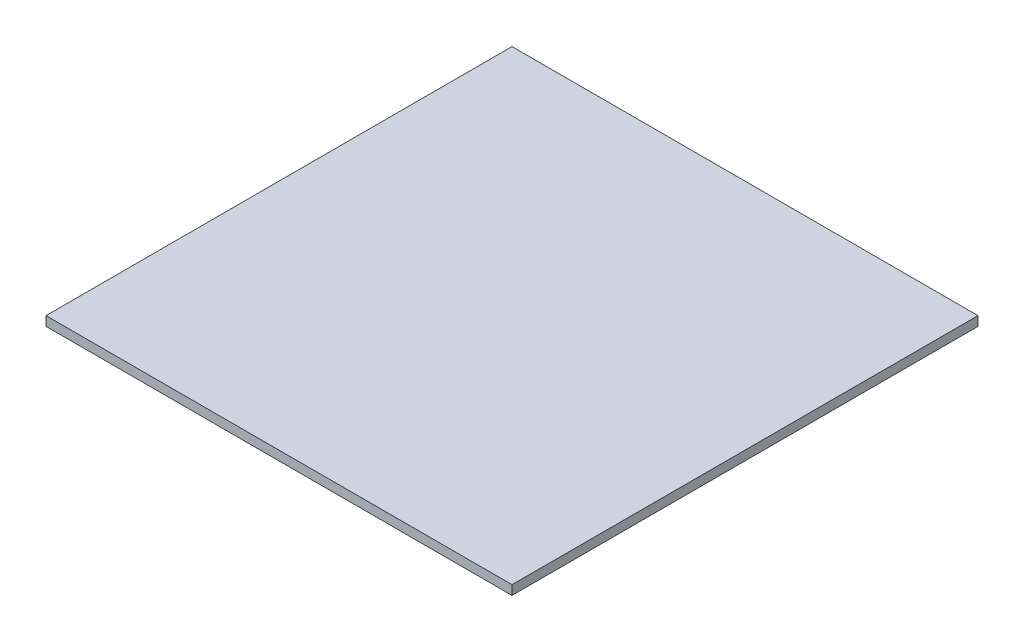
ISO-10303-21;
HEADER;
FILE_DESCRIPTION(('STEP AP214'),'2;1');
FILE_NAME('part.step','',(''),(''),'','','');
FILE_SCHEMA(('AUTOMOTIVE_DESIGN { 1 0 10303 214 1 1 1 1 }'));
ENDSEC;
DATA;
#1=APPLICATION_CONTEXT('core data for automotive mechanical design processes');
#2=APPLICATION_PROTOCOL_DEFINITION('international standard','automotive_design',2000,#1);
#3=PRODUCT_CONTEXT('',#1,'mechanical');
#4=PRODUCT('Part','Part','',(#3));
#5=PRODUCT_RELATED_PRODUCT_CATEGORY('part','',(#4));
#6=PRODUCT_DEFINITION_FORMATION('','',#4);
#7=PRODUCT_DEFINITION_CONTEXT('part definition',#1,'design');
#8=PRODUCT_DEFINITION('design','',#6,#7);
#9=PRODUCT_DEFINITION_SHAPE('','',#8);
#10=(LENGTH_UNIT() NAMED_UNIT(*) SI_UNIT(.MILLI.,.METRE.));
#11=(NAMED_UNIT(*) PLANE_ANGLE_UNIT() SI_UNIT($,.RADIAN.));
#12=(NAMED_UNIT(*) SI_UNIT($,.STERADIAN.) SOLID_ANGLE_UNIT());
#13=UNCERTAINTY_MEASURE_WITH_UNIT(LENGTH_MEASURE(1.E-05),#10,'distance_accuracy_value','');
#14=(GEOMETRIC_REPRESENTATION_CONTEXT(3) GLOBAL_UNCERTAINTY_ASSIGNED_CONTEXT((#13)) GLOBAL_UNIT_ASSIGNED_CONTEXT((#10,
#11,#12)) REPRESENTATION_CONTEXT('',''));
#15=CARTESIAN_POINT('',(0.,0.,0.));
#16=DIRECTION('',(0.,0.,1.));
#17=DIRECTION('',(1.,0.,0.));
#18=AXIS2_PLACEMENT_3D('',#15,#16,#17);
#19=CARTESIAN_POINT('',(0.,0.,0.));
#20=DIRECTION('',(0.,-1.,0.));
#21=DIRECTION('',(0.,0.,-1.));
#22=AXIS2_PLACEMENT_3D('',#19,#20,#21);
#23=PLANE('',#22);
#24=DIRECTION('',(0.,0.,1.));
#25=VECTOR('',#24,1.);
#26=CARTESIAN_POINT('',(-250.,0.,250.));
#27=LINE('',#26,#25);
#28=CARTESIAN_POINT('',(-250.,0.,-250.));
#29=VERTEX_POINT('',#28);
#30=CARTESIAN_POINT('',(-250.,0.,250.));
#31=VERTEX_POINT('',#30);
#32=EDGE_CURVE('E242',#29,#31,#27,.T.);
#33=ORIENTED_EDGE('',*,*,#32,.F.);
#34=DIRECTION('',(-1.,0.,0.));
#35=VECTOR('',#34,1.);
#36=CARTESIAN_POINT('',(-250.,0.,-250.));
#37=LINE('',#36,#35);
#38=CARTESIAN_POINT('',(250.,0.,-250.));
#39=VERTEX_POINT('',#38);
#40=EDGE_CURVE('E247',#39,#29,#37,.T.);
#41=ORIENTED_EDGE('',*,*,#40,.F.);
#42=DIRECTION('',(0.,0.,-1.));
#43=VECTOR('',#42,1.);
#44=CARTESIAN_POINT('',(250.,0.,250.));
#45=LINE('',#44,#43);
#46=CARTESIAN_POINT('',(250.,0.,250.));
#47=VERTEX_POINT('',#46);
#48=EDGE_CURVE('E258',#47,#39,#45,.T.);
#49=ORIENTED_EDGE('',*,*,#48,.F.);
#50=DIRECTION('',(1.,0.,0.));
#51=VECTOR('',#50,1.);
#52=CARTESIAN_POINT('',(-250.,0.,250.));
#53=LINE('',#52,#51);
#54=EDGE_CURVE('E256',#31,#47,#53,.T.);
#55=ORIENTED_EDGE('',*,*,#54,.F.);
#56=EDGE_LOOP('',(#33,#41,#49,#55));
#57=FACE_BOUND('',#56,.T.);
#58=DIRECTION('',(0.,0.,1.));
#59=VECTOR('',#58,1.);
#60=CARTESIAN_POINT('',(50.,0.,-100.));
#61=LINE('',#60,#59);
#62=CARTESIAN_POINT('',(50.,0.,-100.));
#63=VERTEX_POINT('',#62);
#64=CARTESIAN_POINT('',(50.,0.,99.9999999999999));
#65=VERTEX_POINT('',#64);
#66=EDGE_CURVE('E227',#63,#65,#61,.T.);
#67=ORIENTED_EDGE('',*,*,#66,.F.);
#68=DIRECTION('',(1.,0.,0.));
#69=VECTOR('',#68,1.);
#70=CARTESIAN_POINT('',(50.,0.,-100.));
#71=LINE('',#70,#69);
#72=CARTESIAN_POINT('',(-50.,0.,-100.));
#73=VERTEX_POINT('',#72);
#74=EDGE_CURVE('E213',#73,#63,#71,.T.);
#75=ORIENTED_EDGE('',*,*,#74,.F.);
#76=DIRECTION('',(0.,0.,-1.));
#77=VECTOR('',#76,1.);
#78=CARTESIAN_POINT('',(-50.,0.,-100.));
#79=LINE('',#78,#77);
#80=CARTESIAN_POINT('',(-50.,0.,99.9999999999999));
#81=VERTEX_POINT('',#80);
#82=EDGE_CURVE('E218',#81,#73,#79,.T.);
#83=ORIENTED_EDGE('',*,*,#82,.F.);
#84=DIRECTION('',(-1.,0.,0.));
#85=VECTOR('',#84,1.);
#86=CARTESIAN_POINT('',(50.,0.,99.9999999999999));
#87=LINE('',#86,#85);
#88=EDGE_CURVE('E229',#65,#81,#87,.T.);
#89=ORIENTED_EDGE('',*,*,#88,.F.);
#90=EDGE_LOOP('',(#67,#75,#83,#89));
#91=FACE_BOUND('',#90,.T.);
#92=ADVANCED_FACE('F33',(#57,#91),#23,.T.);
#93=CARTESIAN_POINT('',(-250.,10.,250.));
#94=DIRECTION('',(1.,0.,0.));
#95=DIRECTION('',(0.,0.,-1.));
#96=AXIS2_PLACEMENT_3D('',#93,#94,#95);
#97=PLANE('',#96);
#98=ORIENTED_EDGE('',*,*,#32,.T.);
#99=DIRECTION('',(0.,-1.,0.));
#100=VECTOR('',#99,1.);
#101=CARTESIAN_POINT('',(-250.,10.,250.));
#102=LINE('',#101,#100);
#103=CARTESIAN_POINT('',(-250.,10.,250.));
#104=VERTEX_POINT('',#103);
#105=EDGE_CURVE('E11',#104,#31,#102,.T.);
#106=ORIENTED_EDGE('',*,*,#105,.F.);
#107=DIRECTION('',(0.,0.,1.));
#108=VECTOR('',#107,1.);
#109=CARTESIAN_POINT('',(-250.,10.,250.));
#110=LINE('',#109,#108);
#111=CARTESIAN_POINT('',(-250.,10.,-250.));
#112=VERTEX_POINT('',#111);
#113=EDGE_CURVE('E243',#112,#104,#110,.T.);
#114=ORIENTED_EDGE('',*,*,#113,.F.);
#115=DIRECTION('',(0.,-1.,0.));
#116=VECTOR('',#115,1.);
#117=CARTESIAN_POINT('',(-250.,10.,-250.));
#118=LINE('',#117,#116);
#119=EDGE_CURVE('E253',#112,#29,#118,.T.);
#120=ORIENTED_EDGE('',*,*,#119,.T.);
#121=EDGE_LOOP('',(#98,#106,#114,#120));
#122=FACE_BOUND('',#121,.T.);
#123=ADVANCED_FACE('F35',(#122),#97,.F.);
#124=CARTESIAN_POINT('',(-250.,10.,250.));
#125=DIRECTION('',(0.,0.,-1.));
#126=DIRECTION('',(-1.,0.,0.));
#127=AXIS2_PLACEMENT_3D('',#124,#125,#126);
#128=PLANE('',#127);
#129=ORIENTED_EDGE('',*,*,#54,.T.);
#130=DIRECTION('',(0.,-1.,0.));
#131=VECTOR('',#130,1.);
#132=CARTESIAN_POINT('',(250.,10.,250.));
#133=LINE('',#132,#131);
#134=CARTESIAN_POINT('',(250.,10.,250.));
#135=VERTEX_POINT('',#134);
#136=EDGE_CURVE('E41',#135,#47,#133,.T.);
#137=ORIENTED_EDGE('',*,*,#136,.F.);
#138=DIRECTION('',(1.,0.,0.));
#139=VECTOR('',#138,1.);
#140=CARTESIAN_POINT('',(-250.,10.,250.));
#141=LINE('',#140,#139);
#142=EDGE_CURVE('E246',#104,#135,#141,.T.);
#143=ORIENTED_EDGE('',*,*,#142,.F.);
#144=ORIENTED_EDGE('',*,*,#105,.T.);
#145=EDGE_LOOP('',(#129,#137,#143,#144));
#146=FACE_BOUND('',#145,.T.);
#147=ADVANCED_FACE('F286',(#146),#128,.F.);
#148=CARTESIAN_POINT('',(250.,10.,250.));
#149=DIRECTION('',(-1.,0.,0.));
#150=DIRECTION('',(0.,0.,1.));
#151=AXIS2_PLACEMENT_3D('',#148,#149,#150);
#152=PLANE('',#151);
#153=ORIENTED_EDGE('',*,*,#48,.T.);
#154=DIRECTION('',(0.,-1.,0.));
#155=VECTOR('',#154,1.);
#156=CARTESIAN_POINT('',(250.,10.,-250.));
#157=LINE('',#156,#155);
#158=CARTESIAN_POINT('',(250.,10.,-250.));
#159=VERTEX_POINT('',#158);
#160=EDGE_CURVE('E263',#159,#39,#157,.T.);
#161=ORIENTED_EDGE('',*,*,#160,.F.);
#162=DIRECTION('',(0.,0.,-1.));
#163=VECTOR('',#162,1.);
#164=CARTESIAN_POINT('',(250.,10.,250.));
#165=LINE('',#164,#163);
#166=EDGE_CURVE('E249',#135,#159,#165,.T.);
#167=ORIENTED_EDGE('',*,*,#166,.F.);
#168=ORIENTED_EDGE('',*,*,#136,.T.);
#169=EDGE_LOOP('',(#153,#161,#167,#168));
#170=FACE_BOUND('',#169,.T.);
#171=ADVANCED_FACE('F270',(#170),#152,.F.);
#172=CARTESIAN_POINT('',(-250.,10.,-250.));
#173=DIRECTION('',(0.,0.,1.));
#174=DIRECTION('',(1.,0.,0.));
#175=AXIS2_PLACEMENT_3D('',#172,#173,#174);
#176=PLANE('',#175);
#177=ORIENTED_EDGE('',*,*,#40,.T.);
#178=ORIENTED_EDGE('',*,*,#119,.F.);
#179=DIRECTION('',(-1.,0.,0.));
#180=VECTOR('',#179,1.);
#181=CARTESIAN_POINT('',(-250.,10.,-250.));
#182=LINE('',#181,#180);
#183=EDGE_CURVE('E251',#159,#112,#182,.T.);
#184=ORIENTED_EDGE('',*,*,#183,.F.);
#185=ORIENTED_EDGE('',*,*,#160,.T.);
#186=EDGE_LOOP('',(#177,#178,#184,#185));
#187=FACE_BOUND('',#186,.T.);
#188=ADVANCED_FACE('F279',(#187),#176,.F.);
#189=CARTESIAN_POINT('',(0.,10.,0.));
#190=DIRECTION('',(0.,-1.,0.));
#191=DIRECTION('',(0.,0.,-1.));
#192=AXIS2_PLACEMENT_3D('',#189,#190,#191);
#193=PLANE('',#192);
#194=ORIENTED_EDGE('',*,*,#113,.T.);
#195=ORIENTED_EDGE('',*,*,#142,.T.);
#196=ORIENTED_EDGE('',*,*,#166,.T.);
#197=ORIENTED_EDGE('',*,*,#183,.T.);
#198=EDGE_LOOP('',(#194,#195,#196,#197));
#199=FACE_BOUND('',#198,.T.);
#200=ADVANCED_FACE('F285',(#199),#193,.F.);
#201=CARTESIAN_POINT('',(50.,-50.,-100.));
#202=DIRECTION('',(0.,0.,1.));
#203=DIRECTION('',(1.,0.,0.));
#204=AXIS2_PLACEMENT_3D('',#201,#202,#203);
#205=PLANE('',#204);
#206=DIRECTION('',(1.,0.,0.));
#207=VECTOR('',#206,1.);
#208=CARTESIAN_POINT('',(45.5,-14.,-100.));
#209=LINE('',#208,#207);
#210=CARTESIAN_POINT('',(4.5,-14.,-100.));
#211=VERTEX_POINT('',#210);
#212=CARTESIAN_POINT('',(45.5,-14.,-100.));
#213=VERTEX_POINT('',#212);
#214=EDGE_CURVE('E166',#211,#213,#209,.T.);
#215=ORIENTED_EDGE('',*,*,#214,.F.);
#216=DIRECTION('',(0.,1.,0.));
#217=VECTOR('',#216,1.);
#218=CARTESIAN_POINT('',(4.5,-36.,-100.));
#219=LINE('',#218,#217);
#220=CARTESIAN_POINT('',(4.5,-36.,-100.));
#221=VERTEX_POINT('',#220);
#222=EDGE_CURVE('E148',#221,#211,#219,.T.);
#223=ORIENTED_EDGE('',*,*,#222,.F.);
#224=DIRECTION('',(-1.,0.,0.));
#225=VECTOR('',#224,1.);
#226=CARTESIAN_POINT('',(45.5,-36.,-100.));
#227=LINE('',#226,#225);
#228=CARTESIAN_POINT('',(45.5,-36.,-100.));
#229=VERTEX_POINT('',#228);
#230=EDGE_CURVE('E157',#229,#221,#227,.T.);
#231=ORIENTED_EDGE('',*,*,#230,.F.);
#232=DIRECTION('',(0.,-1.,0.));
#233=VECTOR('',#232,1.);
#234=CARTESIAN_POINT('',(45.5,-36.,-100.));
#235=LINE('',#234,#233);
#236=EDGE_CURVE('E48',#213,#229,#235,.T.);
#237=ORIENTED_EDGE('',*,*,#236,.F.);
#238=EDGE_LOOP('',(#215,#223,#231,#237));
#239=FACE_BOUND('',#238,.T.);
#240=DIRECTION('',(-1.,0.,0.));
#241=VECTOR('',#240,1.);
#242=CARTESIAN_POINT('',(-45.5,-36.,-100.));
#243=LINE('',#242,#241);
#244=CARTESIAN_POINT('',(-4.5,-36.,-100.));
#245=VERTEX_POINT('',#244);
#246=CARTESIAN_POINT('',(-45.5,-36.,-100.));
#247=VERTEX_POINT('',#246);
#248=EDGE_CURVE('E184',#245,#247,#243,.T.);
#249=ORIENTED_EDGE('',*,*,#248,.F.);
#250=DIRECTION('',(0.,-1.,0.));
#251=VECTOR('',#250,1.);
#252=CARTESIAN_POINT('',(-4.5,-36.,-100.));
#253=LINE('',#252,#251);
#254=CARTESIAN_POINT('',(-4.5,-14.,-100.));
#255=VERTEX_POINT('',#254);
#256=EDGE_CURVE('E187',#255,#245,#253,.T.);
#257=ORIENTED_EDGE('',*,*,#256,.F.);
#258=DIRECTION('',(1.,0.,0.));
#259=VECTOR('',#258,1.);
#260=CARTESIAN_POINT('',(-45.5,-14.,-100.));
#261=LINE('',#260,#259);
#262=CARTESIAN_POINT('',(-45.5,-14.,-100.));
#263=VERTEX_POINT('',#262);
#264=EDGE_CURVE('E204',#263,#255,#261,.T.);
#265=ORIENTED_EDGE('',*,*,#264,.F.);
#266=DIRECTION('',(0.,1.,0.));
#267=VECTOR('',#266,1.);
#268=CARTESIAN_POINT('',(-45.5,-36.,-100.));
#269=LINE('',#268,#267);
#270=EDGE_CURVE('E160',#247,#263,#269,.T.);
#271=ORIENTED_EDGE('',*,*,#270,.F.);
#272=EDGE_LOOP('',(#249,#257,#265,#271));
#273=FACE_BOUND('',#272,.T.);
#274=ORIENTED_EDGE('',*,*,#74,.T.);
#275=DIRECTION('',(0.,1.,0.));
#276=VECTOR('',#275,1.);
#277=CARTESIAN_POINT('',(50.,-50.,-100.));
#278=LINE('',#277,#276);
#279=CARTESIAN_POINT('',(50.,-50.,-100.));
#280=VERTEX_POINT('',#279);
#281=EDGE_CURVE('E240',#280,#63,#278,.T.);
#282=ORIENTED_EDGE('',*,*,#281,.F.);
#283=DIRECTION('',(1.,0.,0.));
#284=VECTOR('',#283,1.);
#285=CARTESIAN_POINT('',(50.,-50.,-100.));
#286=LINE('',#285,#284);
#287=CARTESIAN_POINT('',(-50.,-50.,-100.));
#288=VERTEX_POINT('',#287);
#289=EDGE_CURVE('E214',#288,#280,#286,.T.);
#290=ORIENTED_EDGE('',*,*,#289,.F.);
#291=DIRECTION('',(0.,1.,0.));
#292=VECTOR('',#291,1.);
#293=CARTESIAN_POINT('',(-50.,-50.,-100.));
#294=LINE('',#293,#292);
#295=EDGE_CURVE('E224',#288,#73,#294,.T.);
#296=ORIENTED_EDGE('',*,*,#295,.T.);
#297=EDGE_LOOP('',(#274,#282,#290,#296));
#298=FACE_BOUND('',#297,.T.);
#299=ADVANCED_FACE('F163',(#239,#273,#298),#205,.F.);
#300=CARTESIAN_POINT('',(50.,-50.,-100.));
#301=DIRECTION('',(-1.,0.,0.));
#302=DIRECTION('',(0.,0.,1.));
#303=AXIS2_PLACEMENT_3D('',#300,#301,#302);
#304=PLANE('',#303);
#305=ORIENTED_EDGE('',*,*,#66,.T.);
#306=DIRECTION('',(0.,1.,0.));
#307=VECTOR('',#306,1.);
#308=CARTESIAN_POINT('',(50.,-50.,99.9999999999999));
#309=LINE('',#308,#307);
#310=CARTESIAN_POINT('',(50.,-50.,99.9999999999999));
#311=VERTEX_POINT('',#310);
#312=EDGE_CURVE('E237',#311,#65,#309,.T.);
#313=ORIENTED_EDGE('',*,*,#312,.F.);
#314=DIRECTION('',(0.,0.,1.));
#315=VECTOR('',#314,1.);
#316=CARTESIAN_POINT('',(50.,-50.,-100.));
#317=LINE('',#316,#315);
#318=EDGE_CURVE('E217',#280,#311,#317,.T.);
#319=ORIENTED_EDGE('',*,*,#318,.F.);
#320=ORIENTED_EDGE('',*,*,#281,.T.);
#321=EDGE_LOOP('',(#305,#313,#319,#320));
#322=FACE_BOUND('',#321,.T.);
#323=ADVANCED_FACE('F307',(#322),#304,.F.);
#324=CARTESIAN_POINT('',(50.,-50.,99.9999999999999));
#325=DIRECTION('',(0.,0.,-1.));
#326=DIRECTION('',(-1.,0.,0.));
#327=AXIS2_PLACEMENT_3D('',#324,#325,#326);
#328=PLANE('',#327);
#329=DIRECTION('',(1.,0.,0.));
#330=VECTOR('',#329,1.);
#331=CARTESIAN_POINT('',(45.5,-36.,99.9999999999999));
#332=LINE('',#331,#330);
#333=CARTESIAN_POINT('',(4.5,-36.,99.9999999999999));
#334=VERTEX_POINT('',#333);
#335=CARTESIAN_POINT('',(45.5,-36.,99.9999999999999));
#336=VERTEX_POINT('',#335);
#337=EDGE_CURVE('E168',#334,#336,#332,.T.);
#338=ORIENTED_EDGE('',*,*,#337,.F.);
#339=DIRECTION('',(0.,-1.,0.));
#340=VECTOR('',#339,1.);
#341=CARTESIAN_POINT('',(4.5,-36.,99.9999999999999));
#342=LINE('',#341,#340);
#343=CARTESIAN_POINT('',(4.5,-14.,99.9999999999999));
#344=VERTEX_POINT('',#343);
#345=EDGE_CURVE('E56',#344,#334,#342,.T.);
#346=ORIENTED_EDGE('',*,*,#345,.F.);
#347=DIRECTION('',(-1.,0.,0.));
#348=VECTOR('',#347,1.);
#349=CARTESIAN_POINT('',(45.5,-14.,99.9999999999999));
#350=LINE('',#349,#348);
#351=CARTESIAN_POINT('',(45.5,-14.,99.9999999999999));
#352=VERTEX_POINT('',#351);
#353=EDGE_CURVE('E154',#352,#344,#350,.T.);
#354=ORIENTED_EDGE('',*,*,#353,.F.);
#355=DIRECTION('',(0.,1.,0.));
#356=VECTOR('',#355,1.);
#357=CARTESIAN_POINT('',(45.5,-36.,99.9999999999999));
#358=LINE('',#357,#356);
#359=EDGE_CURVE('E174',#336,#352,#358,.T.);
#360=ORIENTED_EDGE('',*,*,#359,.F.);
#361=EDGE_LOOP('',(#338,#346,#354,#360));
#362=FACE_BOUND('',#361,.T.);
#363=DIRECTION('',(-1.,0.,0.));
#364=VECTOR('',#363,1.);
#365=CARTESIAN_POINT('',(-45.5,-14.,99.9999999999999));
#366=LINE('',#365,#364);
#367=CARTESIAN_POINT('',(-4.5,-14.,99.9999999999999));
#368=VERTEX_POINT('',#367);
#369=CARTESIAN_POINT('',(-45.5,-14.,99.9999999999999));
#370=VERTEX_POINT('',#369);
#371=EDGE_CURVE('E192',#368,#370,#366,.T.);
#372=ORIENTED_EDGE('',*,*,#371,.F.);
#373=DIRECTION('',(0.,1.,0.));
#374=VECTOR('',#373,1.);
#375=CARTESIAN_POINT('',(-4.5,-36.,99.9999999999999));
#376=LINE('',#375,#374);
#377=CARTESIAN_POINT('',(-4.5,-36.,99.9999999999999));
#378=VERTEX_POINT('',#377);
#379=EDGE_CURVE('E190',#378,#368,#376,.T.);
#380=ORIENTED_EDGE('',*,*,#379,.F.);
#381=DIRECTION('',(1.,0.,0.));
#382=VECTOR('',#381,1.);
#383=CARTESIAN_POINT('',(-45.5,-36.,99.9999999999999));
#384=LINE('',#383,#382);
#385=CARTESIAN_POINT('',(-45.5,-36.,99.9999999999999));
#386=VERTEX_POINT('',#385);
#387=EDGE_CURVE('E198',#386,#378,#384,.T.);
#388=ORIENTED_EDGE('',*,*,#387,.F.);
#389=DIRECTION('',(0.,-1.,0.));
#390=VECTOR('',#389,1.);
#391=CARTESIAN_POINT('',(-45.5,-36.,99.9999999999999));
#392=LINE('',#391,#390);
#393=EDGE_CURVE('E195',#370,#386,#392,.T.);
#394=ORIENTED_EDGE('',*,*,#393,.F.);
#395=EDGE_LOOP('',(#372,#380,#388,#394));
#396=FACE_BOUND('',#395,.T.);
#397=ORIENTED_EDGE('',*,*,#88,.T.);
#398=DIRECTION('',(0.,1.,0.));
#399=VECTOR('',#398,1.);
#400=CARTESIAN_POINT('',(-50.,-50.,99.9999999999999));
#401=LINE('',#400,#399);
#402=CARTESIAN_POINT('',(-50.,-50.,99.9999999999999));
#403=VERTEX_POINT('',#402);
#404=EDGE_CURVE('E235',#403,#81,#401,.T.);
#405=ORIENTED_EDGE('',*,*,#404,.F.);
#406=DIRECTION('',(-1.,0.,0.));
#407=VECTOR('',#406,1.);
#408=CARTESIAN_POINT('',(50.,-50.,99.9999999999999));
#409=LINE('',#408,#407);
#410=EDGE_CURVE('E220',#311,#403,#409,.T.);
#411=ORIENTED_EDGE('',*,*,#410,.F.);
#412=ORIENTED_EDGE('',*,*,#312,.T.);
#413=EDGE_LOOP('',(#397,#405,#411,#412));
#414=FACE_BOUND('',#413,.T.);
#415=ADVANCED_FACE('F311',(#362,#396,#414),#328,.F.);
#416=CARTESIAN_POINT('',(-50.,-50.,-100.));
#417=DIRECTION('',(1.,0.,0.));
#418=DIRECTION('',(0.,0.,-1.));
#419=AXIS2_PLACEMENT_3D('',#416,#417,#418);
#420=PLANE('',#419);
#421=ORIENTED_EDGE('',*,*,#82,.T.);
#422=ORIENTED_EDGE('',*,*,#295,.F.);
#423=DIRECTION('',(0.,0.,-1.));
#424=VECTOR('',#423,1.);
#425=CARTESIAN_POINT('',(-50.,-50.,-100.));
#426=LINE('',#425,#424);
#427=EDGE_CURVE('E222',#403,#288,#426,.T.);
#428=ORIENTED_EDGE('',*,*,#427,.F.);
#429=ORIENTED_EDGE('',*,*,#404,.T.);
#430=EDGE_LOOP('',(#421,#422,#428,#429));
#431=FACE_BOUND('',#430,.T.);
#432=ADVANCED_FACE('F317',(#431),#420,.F.);
#433=CARTESIAN_POINT('',(0.,-50.,0.));
#434=DIRECTION('',(0.,1.,0.));
#435=DIRECTION('',(0.,0.,1.));
#436=AXIS2_PLACEMENT_3D('',#433,#434,#435);
#437=PLANE('',#436);
#438=ORIENTED_EDGE('',*,*,#289,.T.);
#439=ORIENTED_EDGE('',*,*,#318,.T.);
#440=ORIENTED_EDGE('',*,*,#410,.T.);
#441=ORIENTED_EDGE('',*,*,#427,.T.);
#442=EDGE_LOOP('',(#438,#439,#440,#441));
#443=FACE_BOUND('',#442,.T.);
#444=ADVANCED_FACE('F321',(#443),#437,.F.);
#445=CARTESIAN_POINT('',(-4.5,-36.,-250.001));
#446=DIRECTION('',(1.,0.,0.));
#447=DIRECTION('',(0.,0.,-1.));
#448=AXIS2_PLACEMENT_3D('',#445,#446,#447);
#449=PLANE('',#448);
#450=ORIENTED_EDGE('',*,*,#256,.T.);
#451=DIRECTION('',(0.,0.,1.));
#452=VECTOR('',#451,1.);
#453=CARTESIAN_POINT('',(-4.5,-36.,-250.001));
#454=LINE('',#453,#452);
#455=EDGE_CURVE('E202',#245,#378,#454,.T.);
#456=ORIENTED_EDGE('',*,*,#455,.T.);
#457=ORIENTED_EDGE('',*,*,#379,.T.);
#458=DIRECTION('',(0.,0.,1.));
#459=VECTOR('',#458,1.);
#460=CARTESIAN_POINT('',(-4.5,-14.,-250.001));
#461=LINE('',#460,#459);
#462=EDGE_CURVE('E201',#255,#368,#461,.T.);
#463=ORIENTED_EDGE('',*,*,#462,.F.);
#464=EDGE_LOOP('',(#450,#456,#457,#463));
#465=FACE_BOUND('',#464,.T.);
#466=ADVANCED_FACE('F325',(#465),#449,.F.);
#467=CARTESIAN_POINT('',(-45.5,-36.,-250.001));
#468=DIRECTION('',(0.,-1.,0.));
#469=DIRECTION('',(0.,0.,-1.));
#470=AXIS2_PLACEMENT_3D('',#467,#468,#469);
#471=PLANE('',#470);
#472=ORIENTED_EDGE('',*,*,#248,.T.);
#473=DIRECTION('',(0.,0.,1.));
#474=VECTOR('',#473,1.);
#475=CARTESIAN_POINT('',(-45.5,-36.,-250.001));
#476=LINE('',#475,#474);
#477=EDGE_CURVE('E205',#247,#386,#476,.T.);
#478=ORIENTED_EDGE('',*,*,#477,.T.);
#479=ORIENTED_EDGE('',*,*,#387,.T.);
#480=ORIENTED_EDGE('',*,*,#455,.F.);
#481=EDGE_LOOP('',(#472,#478,#479,#480));
#482=FACE_BOUND('',#481,.T.);
#483=ADVANCED_FACE('F329',(#482),#471,.F.);
#484=CARTESIAN_POINT('',(-45.5,-36.,-250.001));
#485=DIRECTION('',(-1.,0.,0.));
#486=DIRECTION('',(0.,0.,1.));
#487=AXIS2_PLACEMENT_3D('',#484,#485,#486);
#488=PLANE('',#487);
#489=ORIENTED_EDGE('',*,*,#270,.T.);
#490=DIRECTION('',(0.,0.,1.));
#491=VECTOR('',#490,1.);
#492=CARTESIAN_POINT('',(-45.5,-14.,-250.001));
#493=LINE('',#492,#491);
#494=EDGE_CURVE('E207',#263,#370,#493,.T.);
#495=ORIENTED_EDGE('',*,*,#494,.T.);
#496=ORIENTED_EDGE('',*,*,#393,.T.);
#497=ORIENTED_EDGE('',*,*,#477,.F.);
#498=EDGE_LOOP('',(#489,#495,#496,#497));
#499=FACE_BOUND('',#498,.T.);
#500=ADVANCED_FACE('F334',(#499),#488,.F.);
#501=CARTESIAN_POINT('',(-45.5,-14.,-250.001));
#502=DIRECTION('',(0.,1.,0.));
#503=DIRECTION('',(0.,0.,1.));
#504=AXIS2_PLACEMENT_3D('',#501,#502,#503);
#505=PLANE('',#504);
#506=ORIENTED_EDGE('',*,*,#264,.T.);
#507=ORIENTED_EDGE('',*,*,#462,.T.);
#508=ORIENTED_EDGE('',*,*,#371,.T.);
#509=ORIENTED_EDGE('',*,*,#494,.F.);
#510=EDGE_LOOP('',(#506,#507,#508,#509));
#511=FACE_BOUND('',#510,.T.);
#512=ADVANCED_FACE('F331',(#511),#505,.F.);
#513=CARTESIAN_POINT('',(4.5,-36.,-250.001));
#514=DIRECTION('',(-1.,0.,0.));
#515=DIRECTION('',(0.,0.,1.));
#516=AXIS2_PLACEMENT_3D('',#513,#514,#515);
#517=PLANE('',#516);
#518=ORIENTED_EDGE('',*,*,#222,.T.);
#519=DIRECTION('',(0.,0.,1.));
#520=VECTOR('',#519,1.);
#521=CARTESIAN_POINT('',(4.5,-14.,-250.001));
#522=LINE('',#521,#520);
#523=EDGE_CURVE('E161',#211,#344,#522,.T.);
#524=ORIENTED_EDGE('',*,*,#523,.T.);
#525=ORIENTED_EDGE('',*,*,#345,.T.);
#526=DIRECTION('',(0.,0.,1.));
#527=VECTOR('',#526,1.);
#528=CARTESIAN_POINT('',(4.5,-36.,-250.001));
#529=LINE('',#528,#527);
#530=EDGE_CURVE('E144',#221,#334,#529,.T.);
#531=ORIENTED_EDGE('',*,*,#530,.F.);
#532=EDGE_LOOP('',(#518,#524,#525,#531));
#533=FACE_BOUND('',#532,.T.);
#534=ADVANCED_FACE('F146',(#533),#517,.F.);
#535=CARTESIAN_POINT('',(45.5,-14.,-250.001));
#536=DIRECTION('',(0.,1.,0.));
#537=DIRECTION('',(-1.,0.,0.));
#538=AXIS2_PLACEMENT_3D('',#535,#536,#537);
#539=PLANE('',#538);
#540=ORIENTED_EDGE('',*,*,#214,.T.);
#541=DIRECTION('',(0.,0.,1.));
#542=VECTOR('',#541,1.);
#543=CARTESIAN_POINT('',(45.5,-14.,-250.001));
#544=LINE('',#543,#542);
#545=EDGE_CURVE('E180',#213,#352,#544,.T.);
#546=ORIENTED_EDGE('',*,*,#545,.T.);
#547=ORIENTED_EDGE('',*,*,#353,.T.);
#548=ORIENTED_EDGE('',*,*,#523,.F.);
#549=EDGE_LOOP('',(#540,#546,#547,#548));
#550=FACE_BOUND('',#549,.T.);
#551=ADVANCED_FACE('F344',(#550),#539,.F.);
#552=CARTESIAN_POINT('',(45.5,-36.,-250.001));
#553=DIRECTION('',(1.,0.,0.));
#554=DIRECTION('',(0.,0.,-1.));
#555=AXIS2_PLACEMENT_3D('',#552,#553,#554);
#556=PLANE('',#555);
#557=ORIENTED_EDGE('',*,*,#236,.T.);
#558=DIRECTION('',(0.,0.,1.));
#559=VECTOR('',#558,1.);
#560=CARTESIAN_POINT('',(45.5,-36.,-250.001));
#561=LINE('',#560,#559);
#562=EDGE_CURVE('E153',#229,#336,#561,.T.);
#563=ORIENTED_EDGE('',*,*,#562,.T.);
#564=ORIENTED_EDGE('',*,*,#359,.T.);
#565=ORIENTED_EDGE('',*,*,#545,.F.);
#566=EDGE_LOOP('',(#557,#563,#564,#565));
#567=FACE_BOUND('',#566,.T.);
#568=ADVANCED_FACE('F347',(#567),#556,.F.);
#569=CARTESIAN_POINT('',(45.5,-36.,-250.001));
#570=DIRECTION('',(0.,-1.,0.));
#571=DIRECTION('',(1.,0.,0.));
#572=AXIS2_PLACEMENT_3D('',#569,#570,#571);
#573=PLANE('',#572);
#574=ORIENTED_EDGE('',*,*,#230,.T.);
#575=ORIENTED_EDGE('',*,*,#530,.T.);
#576=ORIENTED_EDGE('',*,*,#337,.T.);
#577=ORIENTED_EDGE('',*,*,#562,.F.);
#578=EDGE_LOOP('',(#574,#575,#576,#577));
#579=FACE_BOUND('',#578,.T.);
#580=ADVANCED_FACE('F158',(#579),#573,.F.);
#581=CLOSED_SHELL('',(#92,#123,#147,#171,#188,#200,#299,#323,#415,#432,#444,#466,#483,#500,#512,
#534,#551,#568,#580));
#582=MANIFOLD_SOLID_BREP('B2',#581);
#583=ADVANCED_BREP_SHAPE_REPRESENTATION('',(#18,#582),#14);
#584=SHAPE_DEFINITION_REPRESENTATION(#9,#583);
ENDSEC;
END-ISO-10303-21;
